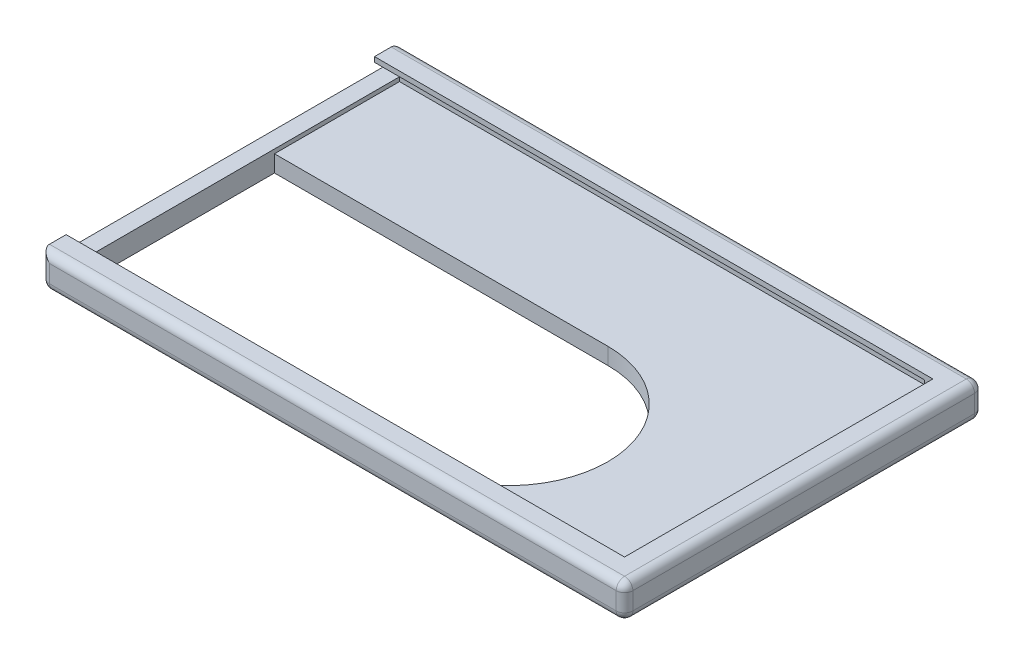
ISO-10303-21;
HEADER;
FILE_DESCRIPTION(('STEP AP214'),'2;1');
FILE_NAME('part.step','',(''),(''),'','','');
FILE_SCHEMA(('AUTOMOTIVE_DESIGN { 1 0 10303 214 1 1 1 1 }'));
ENDSEC;
DATA;
#1=APPLICATION_CONTEXT('core data for automotive mechanical design processes');
#2=APPLICATION_PROTOCOL_DEFINITION('international standard','automotive_design',2000,#1);
#3=PRODUCT_CONTEXT('',#1,'mechanical');
#4=PRODUCT('Part','Part','',(#3));
#5=PRODUCT_RELATED_PRODUCT_CATEGORY('part','',(#4));
#6=PRODUCT_DEFINITION_FORMATION('','',#4);
#7=PRODUCT_DEFINITION_CONTEXT('part definition',#1,'design');
#8=PRODUCT_DEFINITION('design','',#6,#7);
#9=PRODUCT_DEFINITION_SHAPE('','',#8);
#10=(LENGTH_UNIT() NAMED_UNIT(*) SI_UNIT(.MILLI.,.METRE.));
#11=(NAMED_UNIT(*) PLANE_ANGLE_UNIT() SI_UNIT($,.RADIAN.));
#12=(NAMED_UNIT(*) SI_UNIT($,.STERADIAN.) SOLID_ANGLE_UNIT());
#13=UNCERTAINTY_MEASURE_WITH_UNIT(LENGTH_MEASURE(1.E-05),#10,'distance_accuracy_value','');
#14=(GEOMETRIC_REPRESENTATION_CONTEXT(3) GLOBAL_UNCERTAINTY_ASSIGNED_CONTEXT((#13)) GLOBAL_UNIT_ASSIGNED_CONTEXT((#10,
#11,#12)) REPRESENTATION_CONTEXT('',''));
#15=CARTESIAN_POINT('',(0.,0.,0.));
#16=DIRECTION('',(0.,0.,1.));
#17=DIRECTION('',(1.,0.,0.));
#18=AXIS2_PLACEMENT_3D('',#15,#16,#17);
#19=CARTESIAN_POINT('',(0.,2.,0.));
#20=DIRECTION('',(0.,-1.,0.));
#21=DIRECTION('',(0.,0.,-1.));
#22=AXIS2_PLACEMENT_3D('',#19,#20,#21);
#23=PLANE('',#22);
#24=CARTESIAN_POINT('',(40.,2.,27.));
#25=DIRECTION('',(0.,-1.,0.));
#26=DIRECTION('',(0.,0.,-1.));
#27=AXIS2_PLACEMENT_3D('',#24,#25,#26);
#28=CIRCLE('',#27,12.);
#29=CARTESIAN_POINT('',(40.,2.,39.));
#30=VERTEX_POINT('',#29);
#31=CARTESIAN_POINT('',(40.,2.,15.));
#32=VERTEX_POINT('',#31);
#33=EDGE_CURVE('E308',#30,#32,#28,.F.);
#34=ORIENTED_EDGE('',*,*,#33,.F.);
#35=DIRECTION('',(1.,0.,0.));
#36=VECTOR('',#35,1.);
#37=CARTESIAN_POINT('',(0.,2.,39.));
#38=LINE('',#37,#36);
#39=CARTESIAN_POINT('',(64.,2.,39.));
#40=VERTEX_POINT('',#39);
#41=EDGE_CURVE('E362',#30,#40,#38,.T.);
#42=ORIENTED_EDGE('',*,*,#41,.T.);
#43=DIRECTION('',(0.,0.,-1.));
#44=VECTOR('',#43,1.);
#45=CARTESIAN_POINT('',(64.,2.,39.));
#46=LINE('',#45,#44);
#47=CARTESIAN_POINT('',(64.,2.,38.));
#48=VERTEX_POINT('',#47);
#49=EDGE_CURVE('E359',#40,#48,#46,.T.);
#50=ORIENTED_EDGE('',*,*,#49,.T.);
#51=DIRECTION('',(-1.,0.,0.));
#52=VECTOR('',#51,1.);
#53=CARTESIAN_POINT('',(66.,2.,38.));
#54=LINE('',#53,#52);
#55=CARTESIAN_POINT('',(66.,2.,38.));
#56=VERTEX_POINT('',#55);
#57=EDGE_CURVE('E356',#56,#48,#54,.T.);
#58=ORIENTED_EDGE('',*,*,#57,.F.);
#59=DIRECTION('',(0.,0.,1.));
#60=VECTOR('',#59,1.);
#61=CARTESIAN_POINT('',(66.,2.,1.));
#62=LINE('',#61,#60);
#63=CARTESIAN_POINT('',(66.,2.,1.));
#64=VERTEX_POINT('',#63);
#65=EDGE_CURVE('E353',#64,#56,#62,.T.);
#66=ORIENTED_EDGE('',*,*,#65,.F.);
#67=DIRECTION('',(-1.,0.,0.));
#68=VECTOR('',#67,1.);
#69=CARTESIAN_POINT('',(66.,2.,1.));
#70=LINE('',#69,#68);
#71=CARTESIAN_POINT('',(64.,2.,1.));
#72=VERTEX_POINT('',#71);
#73=EDGE_CURVE('E350',#64,#72,#70,.T.);
#74=ORIENTED_EDGE('',*,*,#73,.T.);
#75=DIRECTION('',(0.,0.,1.));
#76=VECTOR('',#75,1.);
#77=CARTESIAN_POINT('',(64.,2.,0.));
#78=LINE('',#77,#76);
#79=CARTESIAN_POINT('',(64.,2.,0.));
#80=VERTEX_POINT('',#79);
#81=EDGE_CURVE('E347',#80,#72,#78,.T.);
#82=ORIENTED_EDGE('',*,*,#81,.F.);
#83=DIRECTION('',(1.,0.,0.));
#84=VECTOR('',#83,1.);
#85=CARTESIAN_POINT('',(0.,2.,0.));
#86=LINE('',#85,#84);
#87=CARTESIAN_POINT('',(0.,2.,0.));
#88=VERTEX_POINT('',#87);
#89=EDGE_CURVE('E344',#88,#80,#86,.T.);
#90=ORIENTED_EDGE('',*,*,#89,.F.);
#91=DIRECTION('',(0.,0.,1.));
#92=VECTOR('',#91,1.);
#93=CARTESIAN_POINT('',(0.,2.,0.));
#94=LINE('',#93,#92);
#95=CARTESIAN_POINT('',(0.,2.,15.));
#96=VERTEX_POINT('',#95);
#97=EDGE_CURVE('E365',#88,#96,#94,.T.);
#98=ORIENTED_EDGE('',*,*,#97,.T.);
#99=DIRECTION('',(-1.,0.,0.));
#100=VECTOR('',#99,1.);
#101=CARTESIAN_POINT('',(0.,2.,15.));
#102=LINE('',#101,#100);
#103=EDGE_CURVE('E306',#32,#96,#102,.T.);
#104=ORIENTED_EDGE('',*,*,#103,.F.);
#105=EDGE_LOOP('',(#34,#42,#50,#58,#66,#74,#82,#90,#98,#104));
#106=FACE_BOUND('',#105,.T.);
#107=ADVANCED_FACE('F39',(#106),#23,.F.);
#108=CARTESIAN_POINT('',(0.,0.,0.));
#109=DIRECTION('',(0.,-1.,0.));
#110=DIRECTION('',(0.,0.,-1.));
#111=AXIS2_PLACEMENT_3D('',#108,#109,#110);
#112=PLANE('',#111);
#113=DIRECTION('',(0.,0.,1.));
#114=VECTOR('',#113,1.);
#115=CARTESIAN_POINT('',(67.,0.,0.));
#116=LINE('',#115,#114);
#117=CARTESIAN_POINT('',(67.,0.,-1.));
#118=VERTEX_POINT('',#117);
#119=CARTESIAN_POINT('',(67.,0.,40.));
#120=VERTEX_POINT('',#119);
#121=EDGE_CURVE('E393',#118,#120,#116,.T.);
#122=ORIENTED_EDGE('',*,*,#121,.T.);
#123=DIRECTION('',(1.,0.,0.));
#124=VECTOR('',#123,1.);
#125=CARTESIAN_POINT('',(-2.,0.,40.));
#126=LINE('',#125,#124);
#127=CARTESIAN_POINT('',(-0.999999999999995,0.,40.));
#128=VERTEX_POINT('',#127);
#129=EDGE_CURVE('E395',#120,#128,#126,.F.);
#130=ORIENTED_EDGE('',*,*,#129,.T.);
#131=DIRECTION('',(0.,0.,1.));
#132=VECTOR('',#131,1.);
#133=CARTESIAN_POINT('',(-1.,0.,-2.));
#134=LINE('',#133,#132);
#135=CARTESIAN_POINT('',(-1.,0.,-1.));
#136=VERTEX_POINT('',#135);
#137=EDGE_CURVE('E389',#128,#136,#134,.F.);
#138=ORIENTED_EDGE('',*,*,#137,.T.);
#139=DIRECTION('',(1.,0.,0.));
#140=VECTOR('',#139,1.);
#141=CARTESIAN_POINT('',(0.,0.,-1.));
#142=LINE('',#141,#140);
#143=EDGE_CURVE('E391',#136,#118,#142,.T.);
#144=ORIENTED_EDGE('',*,*,#143,.T.);
#145=EDGE_LOOP('',(#122,#130,#138,#144));
#146=FACE_BOUND('',#145,.T.);
#147=DIRECTION('',(0.,0.,1.));
#148=VECTOR('',#147,1.);
#149=CARTESIAN_POINT('',(0.,0.,0.));
#150=LINE('',#149,#148);
#151=CARTESIAN_POINT('',(0.,0.,15.));
#152=VERTEX_POINT('',#151);
#153=CARTESIAN_POINT('',(0.,0.,39.));
#154=VERTEX_POINT('',#153);
#155=EDGE_CURVE('E317',#152,#154,#150,.T.);
#156=ORIENTED_EDGE('',*,*,#155,.T.);
#157=DIRECTION('',(1.,0.,0.));
#158=VECTOR('',#157,1.);
#159=CARTESIAN_POINT('',(0.,0.,39.));
#160=LINE('',#159,#158);
#161=CARTESIAN_POINT('',(40.,0.,39.));
#162=VERTEX_POINT('',#161);
#163=EDGE_CURVE('E320',#154,#162,#160,.T.);
#164=ORIENTED_EDGE('',*,*,#163,.T.);
#165=CARTESIAN_POINT('',(40.,0.,27.));
#166=DIRECTION('',(0.,1.,0.));
#167=DIRECTION('',(0.,0.,1.));
#168=AXIS2_PLACEMENT_3D('',#165,#166,#167);
#169=CIRCLE('',#168,12.);
#170=CARTESIAN_POINT('',(40.,0.,15.));
#171=VERTEX_POINT('',#170);
#172=EDGE_CURVE('E304',#171,#162,#169,.F.);
#173=ORIENTED_EDGE('',*,*,#172,.F.);
#174=DIRECTION('',(1.,0.,0.));
#175=VECTOR('',#174,1.);
#176=CARTESIAN_POINT('',(0.,0.,15.));
#177=LINE('',#176,#175);
#178=EDGE_CURVE('E315',#152,#171,#177,.T.);
#179=ORIENTED_EDGE('',*,*,#178,.F.);
#180=EDGE_LOOP('',(#156,#164,#173,#179));
#181=FACE_BOUND('',#180,.T.);
#182=ADVANCED_FACE('F521',(#146,#181),#112,.T.);
#183=CARTESIAN_POINT('',(64.,4.,0.));
#184=DIRECTION('',(-1.,0.,0.));
#185=DIRECTION('',(0.,0.,1.));
#186=AXIS2_PLACEMENT_3D('',#183,#184,#185);
#187=PLANE('',#186);
#188=DIRECTION('',(0.,0.,1.));
#189=VECTOR('',#188,1.);
#190=CARTESIAN_POINT('',(64.,3.5,0.));
#191=LINE('',#190,#189);
#192=CARTESIAN_POINT('',(64.,3.5,38.));
#193=VERTEX_POINT('',#192);
#194=CARTESIAN_POINT('',(64.,3.5,39.));
#195=VERTEX_POINT('',#194);
#196=EDGE_CURVE('E288',#193,#195,#191,.T.);
#197=ORIENTED_EDGE('',*,*,#196,.F.);
#198=DIRECTION('',(0.,-1.,0.));
#199=VECTOR('',#198,1.);
#200=CARTESIAN_POINT('',(64.,4.,38.));
#201=LINE('',#200,#199);
#202=EDGE_CURVE('E312',#193,#48,#201,.T.);
#203=ORIENTED_EDGE('',*,*,#202,.T.);
#204=ORIENTED_EDGE('',*,*,#49,.F.);
#205=DIRECTION('',(0.,-1.,0.));
#206=VECTOR('',#205,1.);
#207=CARTESIAN_POINT('',(64.,4.,39.));
#208=LINE('',#207,#206);
#209=EDGE_CURVE('E342',#195,#40,#208,.T.);
#210=ORIENTED_EDGE('',*,*,#209,.F.);
#211=EDGE_LOOP('',(#197,#203,#204,#210));
#212=FACE_BOUND('',#211,.T.);
#213=ADVANCED_FACE('F556',(#212),#187,.T.);
#214=CARTESIAN_POINT('',(0.,4.,39.));
#215=DIRECTION('',(0.,0.,-1.));
#216=DIRECTION('',(-1.,0.,0.));
#217=AXIS2_PLACEMENT_3D('',#214,#215,#216);
#218=PLANE('',#217);
#219=DIRECTION('',(-1.,0.,0.));
#220=VECTOR('',#219,1.);
#221=CARTESIAN_POINT('',(0.,3.5,39.));
#222=LINE('',#221,#220);
#223=CARTESIAN_POINT('',(-2.,3.5,39.));
#224=VERTEX_POINT('',#223);
#225=EDGE_CURVE('E285',#195,#224,#222,.T.);
#226=ORIENTED_EDGE('',*,*,#225,.F.);
#227=ORIENTED_EDGE('',*,*,#209,.T.);
#228=ORIENTED_EDGE('',*,*,#41,.F.);
#229=DIRECTION('',(0.,-1.,0.));
#230=VECTOR('',#229,1.);
#231=CARTESIAN_POINT('',(40.,59.2712842531054,39.));
#232=LINE('',#231,#230);
#233=EDGE_CURVE('E323',#30,#162,#232,.T.);
#234=ORIENTED_EDGE('',*,*,#233,.T.);
#235=ORIENTED_EDGE('',*,*,#163,.F.);
#236=DIRECTION('',(0.,-1.,0.));
#237=VECTOR('',#236,1.);
#238=CARTESIAN_POINT('',(0.,4.,39.));
#239=LINE('',#238,#237);
#240=CARTESIAN_POINT('',(0.,2.5,39.));
#241=VERTEX_POINT('',#240);
#242=EDGE_CURVE('E340',#241,#154,#239,.T.);
#243=ORIENTED_EDGE('',*,*,#242,.F.);
#244=DIRECTION('',(1.,0.,0.));
#245=VECTOR('',#244,1.);
#246=CARTESIAN_POINT('',(-2.001,2.5,39.));
#247=LINE('',#246,#245);
#248=CARTESIAN_POINT('',(-2.,2.5,39.));
#249=VERTEX_POINT('',#248);
#250=EDGE_CURVE('E301',#249,#241,#247,.T.);
#251=ORIENTED_EDGE('',*,*,#250,.F.);
#252=DIRECTION('',(0.,1.,0.));
#253=VECTOR('',#252,1.);
#254=CARTESIAN_POINT('',(-2.,3.99999999999999,39.));
#255=LINE('',#254,#253);
#256=EDGE_CURVE('E291',#249,#224,#255,.T.);
#257=ORIENTED_EDGE('',*,*,#256,.T.);
#258=EDGE_LOOP('',(#226,#227,#228,#234,#235,#243,#251,#257));
#259=FACE_BOUND('',#258,.T.);
#260=ADVANCED_FACE('F650',(#259),#218,.T.);
#261=CARTESIAN_POINT('',(0.,4.,0.));
#262=DIRECTION('',(1.,0.,0.));
#263=DIRECTION('',(0.,0.,-1.));
#264=AXIS2_PLACEMENT_3D('',#261,#262,#263);
#265=PLANE('',#264);
#266=DIRECTION('',(0.,0.,-1.));
#267=VECTOR('',#266,1.);
#268=CARTESIAN_POINT('',(0.,2.5,0.));
#269=LINE('',#268,#267);
#270=CARTESIAN_POINT('',(0.,2.5,0.));
#271=VERTEX_POINT('',#270);
#272=EDGE_CURVE('E298',#241,#271,#269,.T.);
#273=ORIENTED_EDGE('',*,*,#272,.F.);
#274=ORIENTED_EDGE('',*,*,#242,.T.);
#275=ORIENTED_EDGE('',*,*,#155,.F.);
#276=DIRECTION('',(0.,-1.,0.));
#277=VECTOR('',#276,1.);
#278=CARTESIAN_POINT('',(0.,59.2712842531054,15.));
#279=LINE('',#278,#277);
#280=EDGE_CURVE('E325',#96,#152,#279,.T.);
#281=ORIENTED_EDGE('',*,*,#280,.F.);
#282=ORIENTED_EDGE('',*,*,#97,.F.);
#283=DIRECTION('',(0.,-1.,0.));
#284=VECTOR('',#283,1.);
#285=CARTESIAN_POINT('',(0.,4.,0.));
#286=LINE('',#285,#284);
#287=EDGE_CURVE('E338',#271,#88,#286,.T.);
#288=ORIENTED_EDGE('',*,*,#287,.F.);
#289=EDGE_LOOP('',(#273,#274,#275,#281,#282,#288));
#290=FACE_BOUND('',#289,.T.);
#291=ADVANCED_FACE('F647',(#290),#265,.T.);
#292=CARTESIAN_POINT('',(0.,4.,0.));
#293=DIRECTION('',(0.,0.,-1.));
#294=DIRECTION('',(-1.,0.,0.));
#295=AXIS2_PLACEMENT_3D('',#292,#293,#294);
#296=PLANE('',#295);
#297=DIRECTION('',(0.,-1.,0.));
#298=VECTOR('',#297,1.);
#299=CARTESIAN_POINT('',(64.,4.,0.));
#300=LINE('',#299,#298);
#301=CARTESIAN_POINT('',(64.,3.5,0.));
#302=VERTEX_POINT('',#301);
#303=EDGE_CURVE('E336',#302,#80,#300,.T.);
#304=ORIENTED_EDGE('',*,*,#303,.F.);
#305=DIRECTION('',(-1.,0.,0.));
#306=VECTOR('',#305,1.);
#307=CARTESIAN_POINT('',(0.,3.5,0.));
#308=LINE('',#307,#306);
#309=CARTESIAN_POINT('',(-2.,3.5,0.));
#310=VERTEX_POINT('',#309);
#311=EDGE_CURVE('E283',#302,#310,#308,.T.);
#312=ORIENTED_EDGE('',*,*,#311,.T.);
#313=DIRECTION('',(0.,-1.,0.));
#314=VECTOR('',#313,1.);
#315=CARTESIAN_POINT('',(-2.,4.,0.));
#316=LINE('',#315,#314);
#317=CARTESIAN_POINT('',(-2.,2.5,0.));
#318=VERTEX_POINT('',#317);
#319=EDGE_CURVE('E296',#310,#318,#316,.T.);
#320=ORIENTED_EDGE('',*,*,#319,.T.);
#321=DIRECTION('',(1.,0.,0.));
#322=VECTOR('',#321,1.);
#323=CARTESIAN_POINT('',(-2.00100000000001,2.5,0.));
#324=LINE('',#323,#322);
#325=EDGE_CURVE('E302',#318,#271,#324,.T.);
#326=ORIENTED_EDGE('',*,*,#325,.T.);
#327=ORIENTED_EDGE('',*,*,#287,.T.);
#328=ORIENTED_EDGE('',*,*,#89,.T.);
#329=EDGE_LOOP('',(#304,#312,#320,#326,#327,#328));
#330=FACE_BOUND('',#329,.T.);
#331=ADVANCED_FACE('F643',(#330),#296,.F.);
#332=CARTESIAN_POINT('',(64.,4.,0.));
#333=DIRECTION('',(1.,0.,0.));
#334=DIRECTION('',(0.,0.,-1.));
#335=AXIS2_PLACEMENT_3D('',#332,#333,#334);
#336=PLANE('',#335);
#337=DIRECTION('',(0.,-1.,0.));
#338=VECTOR('',#337,1.);
#339=CARTESIAN_POINT('',(64.,4.,1.));
#340=LINE('',#339,#338);
#341=CARTESIAN_POINT('',(64.,3.5,1.));
#342=VERTEX_POINT('',#341);
#343=EDGE_CURVE('E334',#342,#72,#340,.T.);
#344=ORIENTED_EDGE('',*,*,#343,.F.);
#345=DIRECTION('',(0.,0.,-1.));
#346=VECTOR('',#345,1.);
#347=CARTESIAN_POINT('',(64.,3.5,0.));
#348=LINE('',#347,#346);
#349=EDGE_CURVE('E281',#342,#302,#348,.T.);
#350=ORIENTED_EDGE('',*,*,#349,.T.);
#351=ORIENTED_EDGE('',*,*,#303,.T.);
#352=ORIENTED_EDGE('',*,*,#81,.T.);
#353=EDGE_LOOP('',(#344,#350,#351,#352));
#354=FACE_BOUND('',#353,.T.);
#355=ADVANCED_FACE('F640',(#354),#336,.F.);
#356=CARTESIAN_POINT('',(0.,4.,1.00000000000001));
#357=DIRECTION('',(0.,0.,1.));
#358=DIRECTION('',(1.,0.,0.));
#359=AXIS2_PLACEMENT_3D('',#356,#357,#358);
#360=PLANE('',#359);
#361=DIRECTION('',(1.,0.,0.));
#362=VECTOR('',#361,1.);
#363=CARTESIAN_POINT('',(-2.,3.5,1.));
#364=LINE('',#363,#362);
#365=CARTESIAN_POINT('',(-2.,3.5,1.));
#366=VERTEX_POINT('',#365);
#367=EDGE_CURVE('E263',#366,#342,#364,.T.);
#368=ORIENTED_EDGE('',*,*,#367,.T.);
#369=ORIENTED_EDGE('',*,*,#343,.T.);
#370=ORIENTED_EDGE('',*,*,#73,.F.);
#371=DIRECTION('',(0.,-1.,0.));
#372=VECTOR('',#371,1.);
#373=CARTESIAN_POINT('',(66.,4.,1.));
#374=LINE('',#373,#372);
#375=CARTESIAN_POINT('',(66.,3.5,1.));
#376=VERTEX_POINT('',#375);
#377=EDGE_CURVE('E332',#376,#64,#374,.T.);
#378=ORIENTED_EDGE('',*,*,#377,.F.);
#379=DIRECTION('',(1.,0.,0.));
#380=VECTOR('',#379,1.);
#381=CARTESIAN_POINT('',(0.,3.5,1.00000000000001));
#382=LINE('',#381,#380);
#383=CARTESIAN_POINT('',(65.,3.5,1.));
#384=VERTEX_POINT('',#383);
#385=EDGE_CURVE('E278',#384,#376,#382,.T.);
#386=ORIENTED_EDGE('',*,*,#385,.F.);
#387=DIRECTION('',(0.,1.,0.));
#388=VECTOR('',#387,1.);
#389=CARTESIAN_POINT('',(65.,3.5,1.));
#390=LINE('',#389,#388);
#391=CARTESIAN_POINT('',(65.,4.1,1.));
#392=VERTEX_POINT('',#391);
#393=EDGE_CURVE('E246',#384,#392,#390,.T.);
#394=ORIENTED_EDGE('',*,*,#393,.T.);
#395=DIRECTION('',(1.,0.,0.));
#396=VECTOR('',#395,1.);
#397=CARTESIAN_POINT('',(-2.,4.1,1.));
#398=LINE('',#397,#396);
#399=CARTESIAN_POINT('',(-2.,4.1,1.));
#400=VERTEX_POINT('',#399);
#401=EDGE_CURVE('E229',#400,#392,#398,.T.);
#402=ORIENTED_EDGE('',*,*,#401,.F.);
#403=DIRECTION('',(0.,1.,0.));
#404=VECTOR('',#403,1.);
#405=CARTESIAN_POINT('',(-2.,3.5,1.));
#406=LINE('',#405,#404);
#407=EDGE_CURVE('E238',#366,#400,#406,.T.);
#408=ORIENTED_EDGE('',*,*,#407,.F.);
#409=EDGE_LOOP('',(#368,#369,#370,#378,#386,#394,#402,#408));
#410=FACE_BOUND('',#409,.T.);
#411=ADVANCED_FACE('F249',(#410),#360,.T.);
#412=CARTESIAN_POINT('',(66.,4.,0.));
#413=DIRECTION('',(1.,0.,0.));
#414=DIRECTION('',(0.,0.,-1.));
#415=AXIS2_PLACEMENT_3D('',#412,#413,#414);
#416=PLANE('',#415);
#417=DIRECTION('',(0.,-1.,0.));
#418=VECTOR('',#417,1.);
#419=CARTESIAN_POINT('',(66.,4.,38.));
#420=LINE('',#419,#418);
#421=CARTESIAN_POINT('',(66.,3.5,38.));
#422=VERTEX_POINT('',#421);
#423=EDGE_CURVE('E330',#422,#56,#420,.T.);
#424=ORIENTED_EDGE('',*,*,#423,.F.);
#425=DIRECTION('',(0.,0.,-1.));
#426=VECTOR('',#425,1.);
#427=CARTESIAN_POINT('',(66.,3.5,0.));
#428=LINE('',#427,#426);
#429=EDGE_CURVE('E276',#422,#376,#428,.T.);
#430=ORIENTED_EDGE('',*,*,#429,.T.);
#431=ORIENTED_EDGE('',*,*,#377,.T.);
#432=ORIENTED_EDGE('',*,*,#65,.T.);
#433=EDGE_LOOP('',(#424,#430,#431,#432));
#434=FACE_BOUND('',#433,.T.);
#435=ADVANCED_FACE('F633',(#434),#416,.F.);
#436=CARTESIAN_POINT('',(0.,4.,38.));
#437=DIRECTION('',(0.,0.,1.));
#438=DIRECTION('',(1.,0.,0.));
#439=AXIS2_PLACEMENT_3D('',#436,#437,#438);
#440=PLANE('',#439);
#441=ORIENTED_EDGE('',*,*,#202,.F.);
#442=DIRECTION('',(-1.,0.,0.));
#443=VECTOR('',#442,1.);
#444=CARTESIAN_POINT('',(-2.,3.5,38.));
#445=LINE('',#444,#443);
#446=CARTESIAN_POINT('',(-2.,3.5,38.));
#447=VERTEX_POINT('',#446);
#448=EDGE_CURVE('E247',#193,#447,#445,.T.);
#449=ORIENTED_EDGE('',*,*,#448,.T.);
#450=DIRECTION('',(0.,1.,0.));
#451=VECTOR('',#450,1.);
#452=CARTESIAN_POINT('',(-2.,3.5,38.));
#453=LINE('',#452,#451);
#454=CARTESIAN_POINT('',(-2.,4.1,38.));
#455=VERTEX_POINT('',#454);
#456=EDGE_CURVE('E269',#447,#455,#453,.T.);
#457=ORIENTED_EDGE('',*,*,#456,.T.);
#458=DIRECTION('',(-1.,0.,0.));
#459=VECTOR('',#458,1.);
#460=CARTESIAN_POINT('',(-2.,4.1,38.));
#461=LINE('',#460,#459);
#462=CARTESIAN_POINT('',(65.,4.1,38.));
#463=VERTEX_POINT('',#462);
#464=EDGE_CURVE('E253',#463,#455,#461,.T.);
#465=ORIENTED_EDGE('',*,*,#464,.F.);
#466=DIRECTION('',(0.,1.,0.));
#467=VECTOR('',#466,1.);
#468=CARTESIAN_POINT('',(65.,3.5,38.));
#469=LINE('',#468,#467);
#470=CARTESIAN_POINT('',(65.,3.5,38.));
#471=VERTEX_POINT('',#470);
#472=EDGE_CURVE('E272',#471,#463,#469,.T.);
#473=ORIENTED_EDGE('',*,*,#472,.F.);
#474=DIRECTION('',(1.,0.,0.));
#475=VECTOR('',#474,1.);
#476=CARTESIAN_POINT('',(0.,3.5,38.));
#477=LINE('',#476,#475);
#478=EDGE_CURVE('E271',#471,#422,#477,.T.);
#479=ORIENTED_EDGE('',*,*,#478,.T.);
#480=ORIENTED_EDGE('',*,*,#423,.T.);
#481=ORIENTED_EDGE('',*,*,#57,.T.);
#482=EDGE_LOOP('',(#441,#449,#457,#465,#473,#479,#480,#481));
#483=FACE_BOUND('',#482,.T.);
#484=ADVANCED_FACE('F630',(#483),#440,.F.);
#485=CARTESIAN_POINT('',(0.,4.,-2.));
#486=DIRECTION('',(0.,0.,-1.));
#487=DIRECTION('',(-1.,0.,0.));
#488=AXIS2_PLACEMENT_3D('',#485,#486,#487);
#489=PLANE('',#488);
#490=DIRECTION('',(-1.,0.,0.));
#491=VECTOR('',#490,1.);
#492=CARTESIAN_POINT('',(68.,3.1,-2.));
#493=LINE('',#492,#491);
#494=CARTESIAN_POINT('',(-1.,3.1,-2.));
#495=VERTEX_POINT('',#494);
#496=CARTESIAN_POINT('',(67.,3.1,-2.));
#497=VERTEX_POINT('',#496);
#498=EDGE_CURVE('E48',#495,#497,#493,.F.);
#499=ORIENTED_EDGE('',*,*,#498,.T.);
#500=DIRECTION('',(0.,-1.,0.));
#501=VECTOR('',#500,1.);
#502=CARTESIAN_POINT('',(67.,4.,-2.));
#503=LINE('',#502,#501);
#504=CARTESIAN_POINT('',(67.,1.,-2.));
#505=VERTEX_POINT('',#504);
#506=EDGE_CURVE('E11',#497,#505,#503,.T.);
#507=ORIENTED_EDGE('',*,*,#506,.T.);
#508=DIRECTION('',(1.,0.,0.));
#509=VECTOR('',#508,1.);
#510=CARTESIAN_POINT('',(0.,1.,-2.));
#511=LINE('',#510,#509);
#512=CARTESIAN_POINT('',(-1.,1.,-2.));
#513=VERTEX_POINT('',#512);
#514=EDGE_CURVE('E407',#505,#513,#511,.F.);
#515=ORIENTED_EDGE('',*,*,#514,.T.);
#516=DIRECTION('',(0.,-1.,0.));
#517=VECTOR('',#516,1.);
#518=CARTESIAN_POINT('',(-1.,4.1,-2.));
#519=LINE('',#518,#517);
#520=EDGE_CURVE('E59',#513,#495,#519,.F.);
#521=ORIENTED_EDGE('',*,*,#520,.T.);
#522=EDGE_LOOP('',(#499,#507,#515,#521));
#523=FACE_BOUND('',#522,.T.);
#524=ADVANCED_FACE('F627',(#523),#489,.T.);
#525=CARTESIAN_POINT('',(-2.,4.,0.));
#526=DIRECTION('',(1.,0.,0.));
#527=DIRECTION('',(0.,0.,-1.));
#528=AXIS2_PLACEMENT_3D('',#525,#526,#527);
#529=PLANE('',#528);
#530=DIRECTION('',(0.,0.,1.));
#531=VECTOR('',#530,1.);
#532=CARTESIAN_POINT('',(-2.,1.,41.));
#533=LINE('',#532,#531);
#534=CARTESIAN_POINT('',(-2.,1.,-1.));
#535=VERTEX_POINT('',#534);
#536=CARTESIAN_POINT('',(-2.,1.,40.));
#537=VERTEX_POINT('',#536);
#538=EDGE_CURVE('E377',#535,#537,#533,.T.);
#539=ORIENTED_EDGE('',*,*,#538,.T.);
#540=DIRECTION('',(0.,-1.,0.));
#541=VECTOR('',#540,1.);
#542=CARTESIAN_POINT('',(-2.,4.,40.));
#543=LINE('',#542,#541);
#544=CARTESIAN_POINT('',(-2.,4.1,40.));
#545=VERTEX_POINT('',#544);
#546=EDGE_CURVE('E381',#537,#545,#543,.F.);
#547=ORIENTED_EDGE('',*,*,#546,.T.);
#548=DIRECTION('',(0.,0.,1.));
#549=VECTOR('',#548,1.);
#550=CARTESIAN_POINT('',(-2.,4.1,41.));
#551=LINE('',#550,#549);
#552=EDGE_CURVE('E235',#455,#545,#551,.T.);
#553=ORIENTED_EDGE('',*,*,#552,.F.);
#554=ORIENTED_EDGE('',*,*,#456,.F.);
#555=DIRECTION('',(0.,0.,1.));
#556=VECTOR('',#555,1.);
#557=CARTESIAN_POINT('',(-2.,3.5,41.));
#558=LINE('',#557,#556);
#559=EDGE_CURVE('E259',#447,#224,#558,.T.);
#560=ORIENTED_EDGE('',*,*,#559,.T.);
#561=ORIENTED_EDGE('',*,*,#256,.F.);
#562=DIRECTION('',(0.,0.,1.));
#563=VECTOR('',#562,1.);
#564=CARTESIAN_POINT('',(-2.,2.5,0.));
#565=LINE('',#564,#563);
#566=EDGE_CURVE('E293',#318,#249,#565,.T.);
#567=ORIENTED_EDGE('',*,*,#566,.F.);
#568=ORIENTED_EDGE('',*,*,#319,.F.);
#569=DIRECTION('',(0.,0.,1.));
#570=VECTOR('',#569,1.);
#571=CARTESIAN_POINT('',(-2.,3.5,1.));
#572=LINE('',#571,#570);
#573=EDGE_CURVE('E242',#310,#366,#572,.T.);
#574=ORIENTED_EDGE('',*,*,#573,.T.);
#575=ORIENTED_EDGE('',*,*,#407,.T.);
#576=DIRECTION('',(0.,0.,1.));
#577=VECTOR('',#576,1.);
#578=CARTESIAN_POINT('',(-2.,4.1,1.));
#579=LINE('',#578,#577);
#580=CARTESIAN_POINT('',(-2.,4.1,-1.));
#581=VERTEX_POINT('',#580);
#582=EDGE_CURVE('E223',#581,#400,#579,.T.);
#583=ORIENTED_EDGE('',*,*,#582,.F.);
#584=DIRECTION('',(0.,-1.,0.));
#585=VECTOR('',#584,1.);
#586=CARTESIAN_POINT('',(-2.,0.,-1.));
#587=LINE('',#586,#585);
#588=EDGE_CURVE('E379',#581,#535,#587,.T.);
#589=ORIENTED_EDGE('',*,*,#588,.T.);
#590=EDGE_LOOP('',(#539,#547,#553,#554,#560,#561,#567,#568,#574,#575,#583,#589));
#591=FACE_BOUND('',#590,.T.);
#592=ADVANCED_FACE('F239',(#591),#529,.F.);
#593=CARTESIAN_POINT('',(0.,4.,41.));
#594=DIRECTION('',(0.,0.,-1.));
#595=DIRECTION('',(-1.,0.,0.));
#596=AXIS2_PLACEMENT_3D('',#593,#594,#595);
#597=PLANE('',#596);
#598=DIRECTION('',(1.,0.,0.));
#599=VECTOR('',#598,1.);
#600=CARTESIAN_POINT('',(0.,3.1,41.));
#601=LINE('',#600,#599);
#602=CARTESIAN_POINT('',(67.,3.1,41.));
#603=VERTEX_POINT('',#602);
#604=CARTESIAN_POINT('',(-0.999999999999995,3.1,41.));
#605=VERTEX_POINT('',#604);
#606=EDGE_CURVE('E372',#603,#605,#601,.F.);
#607=ORIENTED_EDGE('',*,*,#606,.T.);
#608=DIRECTION('',(0.,-1.,0.));
#609=VECTOR('',#608,1.);
#610=CARTESIAN_POINT('',(-0.999999999999995,4.,41.));
#611=LINE('',#610,#609);
#612=CARTESIAN_POINT('',(-0.999999999999995,1.,41.));
#613=VERTEX_POINT('',#612);
#614=EDGE_CURVE('E374',#605,#613,#611,.T.);
#615=ORIENTED_EDGE('',*,*,#614,.T.);
#616=DIRECTION('',(1.,0.,0.));
#617=VECTOR('',#616,1.);
#618=CARTESIAN_POINT('',(68.,1.,41.));
#619=LINE('',#618,#617);
#620=CARTESIAN_POINT('',(67.,1.,41.));
#621=VERTEX_POINT('',#620);
#622=EDGE_CURVE('E370',#613,#621,#619,.T.);
#623=ORIENTED_EDGE('',*,*,#622,.T.);
#624=DIRECTION('',(0.,-1.,0.));
#625=VECTOR('',#624,1.);
#626=CARTESIAN_POINT('',(67.,4.1,41.));
#627=LINE('',#626,#625);
#628=EDGE_CURVE('E368',#621,#603,#627,.F.);
#629=ORIENTED_EDGE('',*,*,#628,.T.);
#630=EDGE_LOOP('',(#607,#615,#623,#629));
#631=FACE_BOUND('',#630,.T.);
#632=ADVANCED_FACE('F495',(#631),#597,.F.);
#633=CARTESIAN_POINT('',(68.,4.,0.));
#634=DIRECTION('',(1.,0.,0.));
#635=DIRECTION('',(0.,0.,-1.));
#636=AXIS2_PLACEMENT_3D('',#633,#634,#635);
#637=PLANE('',#636);
#638=DIRECTION('',(0.,0.,-1.));
#639=VECTOR('',#638,1.);
#640=CARTESIAN_POINT('',(68.,3.1,41.));
#641=LINE('',#640,#639);
#642=CARTESIAN_POINT('',(68.,3.1,-1.));
#643=VERTEX_POINT('',#642);
#644=CARTESIAN_POINT('',(68.,3.1,40.));
#645=VERTEX_POINT('',#644);
#646=EDGE_CURVE('E402',#643,#645,#641,.F.);
#647=ORIENTED_EDGE('',*,*,#646,.T.);
#648=DIRECTION('',(0.,-1.,0.));
#649=VECTOR('',#648,1.);
#650=CARTESIAN_POINT('',(68.,0.,40.));
#651=LINE('',#650,#649);
#652=CARTESIAN_POINT('',(68.,1.,40.));
#653=VERTEX_POINT('',#652);
#654=EDGE_CURVE('E404',#645,#653,#651,.T.);
#655=ORIENTED_EDGE('',*,*,#654,.T.);
#656=DIRECTION('',(0.,0.,1.));
#657=VECTOR('',#656,1.);
#658=CARTESIAN_POINT('',(68.,1.,0.));
#659=LINE('',#658,#657);
#660=CARTESIAN_POINT('',(68.,1.,-1.));
#661=VERTEX_POINT('',#660);
#662=EDGE_CURVE('E400',#653,#661,#659,.F.);
#663=ORIENTED_EDGE('',*,*,#662,.T.);
#664=DIRECTION('',(0.,-1.,0.));
#665=VECTOR('',#664,1.);
#666=CARTESIAN_POINT('',(68.,4.,-1.));
#667=LINE('',#666,#665);
#668=EDGE_CURVE('E398',#661,#643,#667,.F.);
#669=ORIENTED_EDGE('',*,*,#668,.T.);
#670=EDGE_LOOP('',(#647,#655,#663,#669));
#671=FACE_BOUND('',#670,.T.);
#672=ADVANCED_FACE('F535',(#671),#637,.T.);
#673=CARTESIAN_POINT('',(0.,59.2712842531054,15.));
#674=DIRECTION('',(0.,0.,-1.));
#675=DIRECTION('',(-1.,0.,0.));
#676=AXIS2_PLACEMENT_3D('',#673,#674,#675);
#677=PLANE('',#676);
#678=ORIENTED_EDGE('',*,*,#103,.T.);
#679=ORIENTED_EDGE('',*,*,#280,.T.);
#680=ORIENTED_EDGE('',*,*,#178,.T.);
#681=DIRECTION('',(0.,-1.,0.));
#682=VECTOR('',#681,1.);
#683=CARTESIAN_POINT('',(40.,59.2712842531054,15.));
#684=LINE('',#683,#682);
#685=EDGE_CURVE('E309',#32,#171,#684,.T.);
#686=ORIENTED_EDGE('',*,*,#685,.F.);
#687=EDGE_LOOP('',(#678,#679,#680,#686));
#688=FACE_BOUND('',#687,.T.);
#689=ADVANCED_FACE('F614',(#688),#677,.F.);
#690=CARTESIAN_POINT('',(40.,59.2712842531054,27.));
#691=DIRECTION('',(0.,-1.,0.));
#692=DIRECTION('',(0.,0.,-1.));
#693=AXIS2_PLACEMENT_3D('',#690,#691,#692);
#694=CYLINDRICAL_SURFACE('',#693,12.);
#695=ORIENTED_EDGE('',*,*,#33,.T.);
#696=ORIENTED_EDGE('',*,*,#685,.T.);
#697=ORIENTED_EDGE('',*,*,#172,.T.);
#698=ORIENTED_EDGE('',*,*,#233,.F.);
#699=EDGE_LOOP('',(#695,#696,#697,#698));
#700=FACE_BOUND('',#699,.T.);
#701=ADVANCED_FACE('F612',(#700),#694,.F.);
#702=CARTESIAN_POINT('',(-2.00100000000001,2.5,0.));
#703=DIRECTION('',(0.,-1.,0.));
#704=DIRECTION('',(0.,0.,-1.));
#705=AXIS2_PLACEMENT_3D('',#702,#703,#704);
#706=PLANE('',#705);
#707=ORIENTED_EDGE('',*,*,#566,.T.);
#708=ORIENTED_EDGE('',*,*,#250,.T.);
#709=ORIENTED_EDGE('',*,*,#272,.T.);
#710=ORIENTED_EDGE('',*,*,#325,.F.);
#711=EDGE_LOOP('',(#707,#708,#709,#710));
#712=FACE_BOUND('',#711,.T.);
#713=ADVANCED_FACE('F609',(#712),#706,.F.);
#714=CARTESIAN_POINT('',(0.,3.5,0.));
#715=DIRECTION('',(0.,-1.,0.));
#716=DIRECTION('',(0.,0.,-1.));
#717=AXIS2_PLACEMENT_3D('',#714,#715,#716);
#718=PLANE('',#717);
#719=ORIENTED_EDGE('',*,*,#311,.F.);
#720=ORIENTED_EDGE('',*,*,#349,.F.);
#721=ORIENTED_EDGE('',*,*,#367,.F.);
#722=ORIENTED_EDGE('',*,*,#573,.F.);
#723=EDGE_LOOP('',(#719,#720,#721,#722));
#724=FACE_BOUND('',#723,.T.);
#725=ADVANCED_FACE('F603',(#724),#718,.T.);
#726=ORIENTED_EDGE('',*,*,#448,.F.);
#727=ORIENTED_EDGE('',*,*,#196,.T.);
#728=ORIENTED_EDGE('',*,*,#225,.T.);
#729=ORIENTED_EDGE('',*,*,#559,.F.);
#730=EDGE_LOOP('',(#726,#727,#728,#729));
#731=FACE_BOUND('',#730,.T.);
#732=ADVANCED_FACE('F604',(#731),#718,.T.);
#733=CARTESIAN_POINT('',(65.,3.5,1.));
#734=DIRECTION('',(-1.,0.,0.));
#735=DIRECTION('',(0.,0.,1.));
#736=AXIS2_PLACEMENT_3D('',#733,#734,#735);
#737=PLANE('',#736);
#738=ORIENTED_EDGE('',*,*,#472,.T.);
#739=DIRECTION('',(0.,0.,1.));
#740=VECTOR('',#739,1.);
#741=CARTESIAN_POINT('',(65.,4.1,1.));
#742=LINE('',#741,#740);
#743=EDGE_CURVE('E251',#392,#463,#742,.T.);
#744=ORIENTED_EDGE('',*,*,#743,.F.);
#745=ORIENTED_EDGE('',*,*,#393,.F.);
#746=DIRECTION('',(0.,0.,1.));
#747=VECTOR('',#746,1.);
#748=CARTESIAN_POINT('',(65.,3.5,1.));
#749=LINE('',#748,#747);
#750=EDGE_CURVE('E265',#384,#471,#749,.T.);
#751=ORIENTED_EDGE('',*,*,#750,.T.);
#752=EDGE_LOOP('',(#738,#744,#745,#751));
#753=FACE_BOUND('',#752,.T.);
#754=ADVANCED_FACE('F600',(#753),#737,.T.);
#755=ORIENTED_EDGE('',*,*,#750,.F.);
#756=ORIENTED_EDGE('',*,*,#385,.T.);
#757=ORIENTED_EDGE('',*,*,#429,.F.);
#758=ORIENTED_EDGE('',*,*,#478,.F.);
#759=EDGE_LOOP('',(#755,#756,#757,#758));
#760=FACE_BOUND('',#759,.T.);
#761=ADVANCED_FACE('F595',(#760),#718,.T.);
#762=CARTESIAN_POINT('',(0.,4.1,0.));
#763=DIRECTION('',(0.,-1.,0.));
#764=DIRECTION('',(0.,0.,-1.));
#765=AXIS2_PLACEMENT_3D('',#762,#763,#764);
#766=PLANE('',#765);
#767=ORIENTED_EDGE('',*,*,#552,.T.);
#768=DIRECTION('',(1.,0.,0.));
#769=VECTOR('',#768,1.);
#770=CARTESIAN_POINT('',(0.,4.1,40.));
#771=LINE('',#770,#769);
#772=CARTESIAN_POINT('',(67.,4.1,40.));
#773=VERTEX_POINT('',#772);
#774=EDGE_CURVE('E387',#545,#773,#771,.T.);
#775=ORIENTED_EDGE('',*,*,#774,.T.);
#776=DIRECTION('',(0.,0.,-1.));
#777=VECTOR('',#776,1.);
#778=CARTESIAN_POINT('',(67.,4.1,-2.));
#779=LINE('',#778,#777);
#780=CARTESIAN_POINT('',(67.,4.1,-1.));
#781=VERTEX_POINT('',#780);
#782=EDGE_CURVE('E385',#773,#781,#779,.T.);
#783=ORIENTED_EDGE('',*,*,#782,.T.);
#784=DIRECTION('',(-1.,0.,0.));
#785=VECTOR('',#784,1.);
#786=CARTESIAN_POINT('',(-2.,4.1,-1.));
#787=LINE('',#786,#785);
#788=EDGE_CURVE('E232',#781,#581,#787,.T.);
#789=ORIENTED_EDGE('',*,*,#788,.T.);
#790=ORIENTED_EDGE('',*,*,#582,.T.);
#791=ORIENTED_EDGE('',*,*,#401,.T.);
#792=ORIENTED_EDGE('',*,*,#743,.T.);
#793=ORIENTED_EDGE('',*,*,#464,.T.);
#794=EDGE_LOOP('',(#767,#775,#783,#789,#790,#791,#792,#793));
#795=FACE_BOUND('',#794,.T.);
#796=ADVANCED_FACE('F226',(#795),#766,.F.);
#797=CARTESIAN_POINT('',(67.,4.,-1.));
#798=DIRECTION('',(0.,-1.,0.));
#799=DIRECTION('',(0.,0.,-1.));
#800=AXIS2_PLACEMENT_3D('',#797,#798,#799);
#801=CYLINDRICAL_SURFACE('',#800,1.);
#802=CARTESIAN_POINT('',(67.,1.,-1.));
#803=DIRECTION('',(0.,-1.,0.));
#804=DIRECTION('',(0.,0.,-1.));
#805=AXIS2_PLACEMENT_3D('',#802,#803,#804);
#806=CIRCLE('',#805,1.);
#807=EDGE_CURVE('E43',#505,#661,#806,.T.);
#808=ORIENTED_EDGE('',*,*,#807,.F.);
#809=ORIENTED_EDGE('',*,*,#506,.F.);
#810=CARTESIAN_POINT('',(67.,3.1,-1.));
#811=DIRECTION('',(0.,1.,0.));
#812=DIRECTION('',(0.,0.,1.));
#813=AXIS2_PLACEMENT_3D('',#810,#811,#812);
#814=CIRCLE('',#813,1.);
#815=EDGE_CURVE('E458',#643,#497,#814,.T.);
#816=ORIENTED_EDGE('',*,*,#815,.F.);
#817=ORIENTED_EDGE('',*,*,#668,.F.);
#818=EDGE_LOOP('',(#808,#809,#816,#817));
#819=FACE_BOUND('',#818,.T.);
#820=ADVANCED_FACE('F41',(#819),#801,.T.);
#821=CARTESIAN_POINT('',(67.,1.,-1.));
#822=DIRECTION('',(1.,0.,0.));
#823=DIRECTION('',(0.,0.,-1.));
#824=AXIS2_PLACEMENT_3D('',#821,#822,#823);
#825=SPHERICAL_SURFACE('',#824,1.);
#826=CARTESIAN_POINT('',(67.,1.,-1.));
#827=DIRECTION('',(1.,0.,0.));
#828=DIRECTION('',(0.,0.,-1.));
#829=AXIS2_PLACEMENT_3D('',#826,#827,#828);
#830=CIRCLE('',#829,1.);
#831=EDGE_CURVE('E452',#505,#118,#830,.F.);
#832=ORIENTED_EDGE('',*,*,#831,.F.);
#833=ORIENTED_EDGE('',*,*,#807,.T.);
#834=CARTESIAN_POINT('',(67.,1.,-1.));
#835=DIRECTION('',(0.,0.,-1.));
#836=DIRECTION('',(-1.,0.,0.));
#837=AXIS2_PLACEMENT_3D('',#834,#835,#836);
#838=CIRCLE('',#837,1.);
#839=EDGE_CURVE('E455',#118,#661,#838,.F.);
#840=ORIENTED_EDGE('',*,*,#839,.F.);
#841=EDGE_LOOP('',(#832,#833,#840));
#842=FACE_BOUND('',#841,.T.);
#843=ADVANCED_FACE('F548',(#842),#825,.T.);
#844=CARTESIAN_POINT('',(0.,3.1,-1.));
#845=DIRECTION('',(1.,0.,0.));
#846=DIRECTION('',(0.,0.,-1.));
#847=AXIS2_PLACEMENT_3D('',#844,#845,#846);
#848=CYLINDRICAL_SURFACE('',#847,1.);
#849=CARTESIAN_POINT('',(67.,3.1,-1.));
#850=DIRECTION('',(1.,0.,0.));
#851=DIRECTION('',(0.,0.,-1.));
#852=AXIS2_PLACEMENT_3D('',#849,#850,#851);
#853=CIRCLE('',#852,1.);
#854=EDGE_CURVE('E460',#497,#781,#853,.T.);
#855=ORIENTED_EDGE('',*,*,#854,.F.);
#856=ORIENTED_EDGE('',*,*,#498,.F.);
#857=CARTESIAN_POINT('',(-1.,3.1,-1.));
#858=DIRECTION('',(0.707106781186547,0.707106781186547,0.));
#859=DIRECTION('',(-0.707106781186547,0.707106781186547,0.));
#860=AXIS2_PLACEMENT_3D('',#857,#858,#859);
#861=ELLIPSE('',#860,1.41421356237309,1.);
#862=EDGE_CURVE('E449',#581,#495,#861,.F.);
#863=ORIENTED_EDGE('',*,*,#862,.F.);
#864=ORIENTED_EDGE('',*,*,#788,.F.);
#865=EDGE_LOOP('',(#855,#856,#863,#864));
#866=FACE_BOUND('',#865,.T.);
#867=ADVANCED_FACE('F508',(#866),#848,.T.);
#868=CARTESIAN_POINT('',(67.,3.1,-1.));
#869=DIRECTION('',(0.,0.,-1.));
#870=DIRECTION('',(-1.,0.,0.));
#871=AXIS2_PLACEMENT_3D('',#868,#869,#870);
#872=SPHERICAL_SURFACE('',#871,1.);
#873=ORIENTED_EDGE('',*,*,#815,.T.);
#874=ORIENTED_EDGE('',*,*,#854,.T.);
#875=CARTESIAN_POINT('',(67.,3.1,-1.));
#876=DIRECTION('',(0.,0.,-1.));
#877=DIRECTION('',(-1.,0.,0.));
#878=AXIS2_PLACEMENT_3D('',#875,#876,#877);
#879=CIRCLE('',#878,1.);
#880=EDGE_CURVE('E446',#643,#781,#879,.F.);
#881=ORIENTED_EDGE('',*,*,#880,.F.);
#882=EDGE_LOOP('',(#873,#874,#881));
#883=FACE_BOUND('',#882,.T.);
#884=ADVANCED_FACE('F539',(#883),#872,.T.);
#885=CARTESIAN_POINT('',(67.,1.,0.));
#886=DIRECTION('',(0.,0.,1.));
#887=DIRECTION('',(1.,0.,0.));
#888=AXIS2_PLACEMENT_3D('',#885,#886,#887);
#889=CYLINDRICAL_SURFACE('',#888,1.);
#890=ORIENTED_EDGE('',*,*,#839,.T.);
#891=ORIENTED_EDGE('',*,*,#662,.F.);
#892=CARTESIAN_POINT('',(67.,1.,40.));
#893=DIRECTION('',(0.,0.,1.));
#894=DIRECTION('',(1.,0.,0.));
#895=AXIS2_PLACEMENT_3D('',#892,#893,#894);
#896=CIRCLE('',#895,1.);
#897=EDGE_CURVE('E441',#120,#653,#896,.T.);
#898=ORIENTED_EDGE('',*,*,#897,.F.);
#899=ORIENTED_EDGE('',*,*,#121,.F.);
#900=EDGE_LOOP('',(#890,#891,#898,#899));
#901=FACE_BOUND('',#900,.T.);
#902=ADVANCED_FACE('F527',(#901),#889,.T.);
#903=CARTESIAN_POINT('',(0.,1.,-1.));
#904=DIRECTION('',(1.,0.,0.));
#905=DIRECTION('',(0.,0.,-1.));
#906=AXIS2_PLACEMENT_3D('',#903,#904,#905);
#907=CYLINDRICAL_SURFACE('',#906,1.);
#908=ORIENTED_EDGE('',*,*,#831,.T.);
#909=ORIENTED_EDGE('',*,*,#143,.F.);
#910=CARTESIAN_POINT('',(-1.,1.,-1.));
#911=DIRECTION('',(-1.,0.,0.));
#912=DIRECTION('',(0.,-1.,0.));
#913=AXIS2_PLACEMENT_3D('',#910,#911,#912);
#914=CIRCLE('',#913,1.);
#915=EDGE_CURVE('E438',#513,#136,#914,.T.);
#916=ORIENTED_EDGE('',*,*,#915,.F.);
#917=ORIENTED_EDGE('',*,*,#514,.F.);
#918=EDGE_LOOP('',(#908,#909,#916,#917));
#919=FACE_BOUND('',#918,.T.);
#920=ADVANCED_FACE('F546',(#919),#907,.T.);
#921=CARTESIAN_POINT('',(-1.,4.,-1.));
#922=DIRECTION('',(0.,1.,0.));
#923=DIRECTION('',(0.,0.,1.));
#924=AXIS2_PLACEMENT_3D('',#921,#922,#923);
#925=CYLINDRICAL_SURFACE('',#924,1.);
#926=ORIENTED_EDGE('',*,*,#862,.T.);
#927=ORIENTED_EDGE('',*,*,#520,.F.);
#928=CARTESIAN_POINT('',(-1.,1.,-1.));
#929=DIRECTION('',(0.,-1.,0.));
#930=DIRECTION('',(0.,0.,-1.));
#931=AXIS2_PLACEMENT_3D('',#928,#929,#930);
#932=CIRCLE('',#931,1.);
#933=EDGE_CURVE('E435',#535,#513,#932,.T.);
#934=ORIENTED_EDGE('',*,*,#933,.F.);
#935=ORIENTED_EDGE('',*,*,#588,.F.);
#936=EDGE_LOOP('',(#926,#927,#934,#935));
#937=FACE_BOUND('',#936,.T.);
#938=ADVANCED_FACE('F512',(#937),#925,.T.);
#939=CARTESIAN_POINT('',(67.,3.1,0.));
#940=DIRECTION('',(0.,0.,1.));
#941=DIRECTION('',(1.,0.,0.));
#942=AXIS2_PLACEMENT_3D('',#939,#940,#941);
#943=CYLINDRICAL_SURFACE('',#942,1.);
#944=ORIENTED_EDGE('',*,*,#880,.T.);
#945=ORIENTED_EDGE('',*,*,#782,.F.);
#946=CARTESIAN_POINT('',(67.,3.1,40.));
#947=DIRECTION('',(0.,0.,1.));
#948=DIRECTION('',(1.,0.,0.));
#949=AXIS2_PLACEMENT_3D('',#946,#947,#948);
#950=CIRCLE('',#949,1.);
#951=EDGE_CURVE('E432',#645,#773,#950,.T.);
#952=ORIENTED_EDGE('',*,*,#951,.F.);
#953=ORIENTED_EDGE('',*,*,#646,.F.);
#954=EDGE_LOOP('',(#944,#945,#952,#953));
#955=FACE_BOUND('',#954,.T.);
#956=ADVANCED_FACE('F506',(#955),#943,.T.);
#957=CARTESIAN_POINT('',(67.,4.,40.));
#958=DIRECTION('',(0.,1.,0.));
#959=DIRECTION('',(0.,0.,1.));
#960=AXIS2_PLACEMENT_3D('',#957,#958,#959);
#961=CYLINDRICAL_SURFACE('',#960,1.);
#962=CARTESIAN_POINT('',(67.,1.,40.));
#963=DIRECTION('',(0.,-1.,0.));
#964=DIRECTION('',(0.,0.,-1.));
#965=AXIS2_PLACEMENT_3D('',#962,#963,#964);
#966=CIRCLE('',#965,1.);
#967=EDGE_CURVE('E443',#653,#621,#966,.T.);
#968=ORIENTED_EDGE('',*,*,#967,.F.);
#969=ORIENTED_EDGE('',*,*,#654,.F.);
#970=CARTESIAN_POINT('',(67.,3.1,40.));
#971=DIRECTION('',(0.,1.,0.));
#972=DIRECTION('',(0.,0.,1.));
#973=AXIS2_PLACEMENT_3D('',#970,#971,#972);
#974=CIRCLE('',#973,1.);
#975=EDGE_CURVE('E429',#603,#645,#974,.T.);
#976=ORIENTED_EDGE('',*,*,#975,.F.);
#977=ORIENTED_EDGE('',*,*,#628,.F.);
#978=EDGE_LOOP('',(#968,#969,#976,#977));
#979=FACE_BOUND('',#978,.T.);
#980=ADVANCED_FACE('F533',(#979),#961,.T.);
#981=CARTESIAN_POINT('',(67.,1.,40.));
#982=DIRECTION('',(1.,0.,0.));
#983=DIRECTION('',(0.,0.,-1.));
#984=AXIS2_PLACEMENT_3D('',#981,#982,#983);
#985=SPHERICAL_SURFACE('',#984,1.);
#986=ORIENTED_EDGE('',*,*,#897,.T.);
#987=ORIENTED_EDGE('',*,*,#967,.T.);
#988=CARTESIAN_POINT('',(67.,1.,40.));
#989=DIRECTION('',(1.,0.,0.));
#990=DIRECTION('',(0.,0.,-1.));
#991=AXIS2_PLACEMENT_3D('',#988,#989,#990);
#992=CIRCLE('',#991,1.);
#993=EDGE_CURVE('E426',#120,#621,#992,.F.);
#994=ORIENTED_EDGE('',*,*,#993,.F.);
#995=EDGE_LOOP('',(#986,#987,#994));
#996=FACE_BOUND('',#995,.T.);
#997=ADVANCED_FACE('F530',(#996),#985,.T.);
#998=CARTESIAN_POINT('',(-1.,1.,-1.));
#999=DIRECTION('',(0.,0.,-1.));
#1000=DIRECTION('',(-1.,0.,0.));
#1001=AXIS2_PLACEMENT_3D('',#998,#999,#1000);
#1002=SPHERICAL_SURFACE('',#1001,1.);
#1003=ORIENTED_EDGE('',*,*,#933,.T.);
#1004=ORIENTED_EDGE('',*,*,#915,.T.);
#1005=CARTESIAN_POINT('',(-1.,1.,-1.));
#1006=DIRECTION('',(0.,0.,-1.));
#1007=DIRECTION('',(-1.,0.,0.));
#1008=AXIS2_PLACEMENT_3D('',#1005,#1006,#1007);
#1009=CIRCLE('',#1008,1.);
#1010=EDGE_CURVE('E423',#535,#136,#1009,.F.);
#1011=ORIENTED_EDGE('',*,*,#1010,.F.);
#1012=EDGE_LOOP('',(#1003,#1004,#1011));
#1013=FACE_BOUND('',#1012,.T.);
#1014=ADVANCED_FACE('F516',(#1013),#1002,.T.);
#1015=CARTESIAN_POINT('',(67.,3.1,40.));
#1016=DIRECTION('',(1.,0.,0.));
#1017=DIRECTION('',(0.,0.,-1.));
#1018=AXIS2_PLACEMENT_3D('',#1015,#1016,#1017);
#1019=SPHERICAL_SURFACE('',#1018,1.);
#1020=ORIENTED_EDGE('',*,*,#975,.T.);
#1021=ORIENTED_EDGE('',*,*,#951,.T.);
#1022=CARTESIAN_POINT('',(67.,3.1,40.));
#1023=DIRECTION('',(1.,0.,0.));
#1024=DIRECTION('',(0.,0.,-1.));
#1025=AXIS2_PLACEMENT_3D('',#1022,#1023,#1024);
#1026=CIRCLE('',#1025,1.);
#1027=EDGE_CURVE('E420',#603,#773,#1026,.F.);
#1028=ORIENTED_EDGE('',*,*,#1027,.F.);
#1029=EDGE_LOOP('',(#1020,#1021,#1028));
#1030=FACE_BOUND('',#1029,.T.);
#1031=ADVANCED_FACE('F502',(#1030),#1019,.T.);
#1032=CARTESIAN_POINT('',(0.,1.,40.));
#1033=DIRECTION('',(-1.,0.,0.));
#1034=DIRECTION('',(0.,0.,1.));
#1035=AXIS2_PLACEMENT_3D('',#1032,#1033,#1034);
#1036=CYLINDRICAL_SURFACE('',#1035,1.);
#1037=ORIENTED_EDGE('',*,*,#993,.T.);
#1038=ORIENTED_EDGE('',*,*,#622,.F.);
#1039=CARTESIAN_POINT('',(-0.999999999999995,1.,40.));
#1040=DIRECTION('',(-1.,0.,0.));
#1041=DIRECTION('',(0.,0.,1.));
#1042=AXIS2_PLACEMENT_3D('',#1039,#1040,#1041);
#1043=CIRCLE('',#1042,1.);
#1044=EDGE_CURVE('E417',#128,#613,#1043,.T.);
#1045=ORIENTED_EDGE('',*,*,#1044,.F.);
#1046=ORIENTED_EDGE('',*,*,#129,.F.);
#1047=EDGE_LOOP('',(#1037,#1038,#1045,#1046));
#1048=FACE_BOUND('',#1047,.T.);
#1049=ADVANCED_FACE('F491',(#1048),#1036,.T.);
#1050=CARTESIAN_POINT('',(-1.,1.,0.));
#1051=DIRECTION('',(0.,0.,-1.));
#1052=DIRECTION('',(-1.,0.,0.));
#1053=AXIS2_PLACEMENT_3D('',#1050,#1051,#1052);
#1054=CYLINDRICAL_SURFACE('',#1053,1.);
#1055=ORIENTED_EDGE('',*,*,#1010,.T.);
#1056=ORIENTED_EDGE('',*,*,#137,.F.);
#1057=CARTESIAN_POINT('',(-0.999999999999995,1.,40.));
#1058=DIRECTION('',(0.,0.,1.));
#1059=DIRECTION('',(1.,0.,0.));
#1060=AXIS2_PLACEMENT_3D('',#1057,#1058,#1059);
#1061=CIRCLE('',#1060,1.);
#1062=EDGE_CURVE('E415',#537,#128,#1061,.T.);
#1063=ORIENTED_EDGE('',*,*,#1062,.F.);
#1064=ORIENTED_EDGE('',*,*,#538,.F.);
#1065=EDGE_LOOP('',(#1055,#1056,#1063,#1064));
#1066=FACE_BOUND('',#1065,.T.);
#1067=ADVANCED_FACE('F518',(#1066),#1054,.T.);
#1068=CARTESIAN_POINT('',(0.,3.1,40.));
#1069=DIRECTION('',(1.,0.,0.));
#1070=DIRECTION('',(0.,0.,-1.));
#1071=AXIS2_PLACEMENT_3D('',#1068,#1069,#1070);
#1072=CYLINDRICAL_SURFACE('',#1071,1.);
#1073=ORIENTED_EDGE('',*,*,#1027,.T.);
#1074=ORIENTED_EDGE('',*,*,#774,.F.);
#1075=CARTESIAN_POINT('',(-0.999999999999995,3.1,40.));
#1076=DIRECTION('',(0.707106781186547,0.707106781186547,0.));
#1077=DIRECTION('',(0.707106781186547,-0.707106781186547,0.));
#1078=AXIS2_PLACEMENT_3D('',#1075,#1076,#1077);
#1079=ELLIPSE('',#1078,1.41421356237309,1.);
#1080=EDGE_CURVE('E413',#605,#545,#1079,.F.);
#1081=ORIENTED_EDGE('',*,*,#1080,.F.);
#1082=ORIENTED_EDGE('',*,*,#606,.F.);
#1083=EDGE_LOOP('',(#1073,#1074,#1081,#1082));
#1084=FACE_BOUND('',#1083,.T.);
#1085=ADVANCED_FACE('F499',(#1084),#1072,.T.);
#1086=CARTESIAN_POINT('',(-0.999999999999995,1.,40.));
#1087=DIRECTION('',(0.,-1.,0.));
#1088=DIRECTION('',(0.,0.,-1.));
#1089=AXIS2_PLACEMENT_3D('',#1086,#1087,#1088);
#1090=SPHERICAL_SURFACE('',#1089,1.);
#1091=ORIENTED_EDGE('',*,*,#1062,.T.);
#1092=ORIENTED_EDGE('',*,*,#1044,.T.);
#1093=CARTESIAN_POINT('',(-0.999999999999995,1.,40.));
#1094=DIRECTION('',(0.,-1.,0.));
#1095=DIRECTION('',(0.,0.,-1.));
#1096=AXIS2_PLACEMENT_3D('',#1093,#1094,#1095);
#1097=CIRCLE('',#1096,1.);
#1098=EDGE_CURVE('E411',#537,#613,#1097,.F.);
#1099=ORIENTED_EDGE('',*,*,#1098,.F.);
#1100=EDGE_LOOP('',(#1091,#1092,#1099));
#1101=FACE_BOUND('',#1100,.T.);
#1102=ADVANCED_FACE('F485',(#1101),#1090,.T.);
#1103=CARTESIAN_POINT('',(-0.999999999999995,4.,40.));
#1104=DIRECTION('',(0.,-1.,0.));
#1105=DIRECTION('',(0.,0.,-1.));
#1106=AXIS2_PLACEMENT_3D('',#1103,#1104,#1105);
#1107=CYLINDRICAL_SURFACE('',#1106,1.);
#1108=ORIENTED_EDGE('',*,*,#1080,.T.);
#1109=ORIENTED_EDGE('',*,*,#546,.F.);
#1110=ORIENTED_EDGE('',*,*,#1098,.T.);
#1111=ORIENTED_EDGE('',*,*,#614,.F.);
#1112=EDGE_LOOP('',(#1108,#1109,#1110,#1111));
#1113=FACE_BOUND('',#1112,.T.);
#1114=ADVANCED_FACE('F481',(#1113),#1107,.T.);
#1115=CLOSED_SHELL('',(#107,#182,#213,#260,#291,#331,#355,#411,#435,#484,#524,#592,#632,#672,
#689,#701,#713,#725,#732,#754,#761,#796,#820,#843,#867,#884,#902,#920,#938,#956,#980,#997,#1014,
#1031,#1049,#1067,#1085,#1102,#1114));
#1116=MANIFOLD_SOLID_BREP('B2',#1115);
#1117=ADVANCED_BREP_SHAPE_REPRESENTATION('',(#18,#1116),#14);
#1118=SHAPE_DEFINITION_REPRESENTATION(#9,#1117);
ENDSEC;
END-ISO-10303-21;
